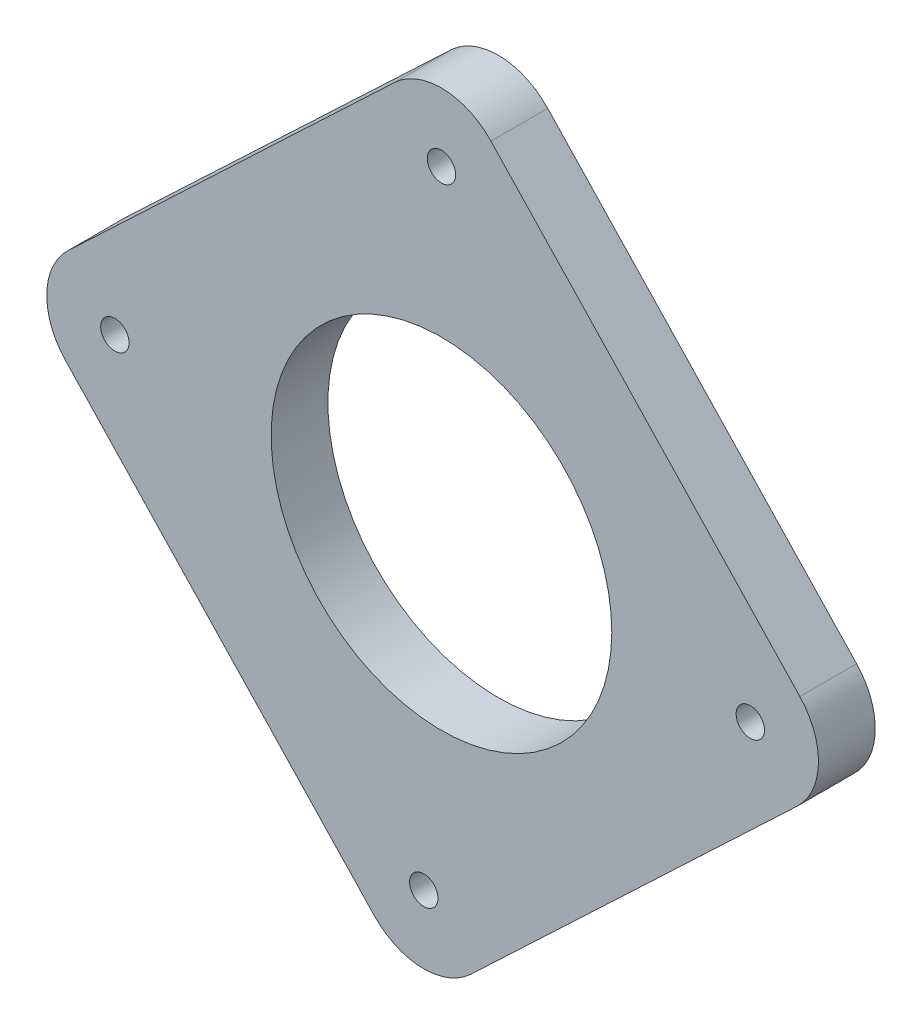
ISO-10303-21;
HEADER;
FILE_DESCRIPTION(('STEP AP214'),'2;1');
FILE_NAME('part.step','',(''),(''),'','','');
FILE_SCHEMA(('AUTOMOTIVE_DESIGN { 1 0 10303 214 1 1 1 1 }'));
ENDSEC;
DATA;
#1=APPLICATION_CONTEXT('core data for automotive mechanical design processes');
#2=APPLICATION_PROTOCOL_DEFINITION('international standard','automotive_design',2000,#1);
#3=PRODUCT_CONTEXT('',#1,'mechanical');
#4=PRODUCT('Part','Part','',(#3));
#5=PRODUCT_RELATED_PRODUCT_CATEGORY('part','',(#4));
#6=PRODUCT_DEFINITION_FORMATION('','',#4);
#7=PRODUCT_DEFINITION_CONTEXT('part definition',#1,'design');
#8=PRODUCT_DEFINITION('design','',#6,#7);
#9=PRODUCT_DEFINITION_SHAPE('','',#8);
#10=(LENGTH_UNIT() NAMED_UNIT(*) SI_UNIT(.MILLI.,.METRE.));
#11=(NAMED_UNIT(*) PLANE_ANGLE_UNIT() SI_UNIT($,.RADIAN.));
#12=(NAMED_UNIT(*) SI_UNIT($,.STERADIAN.) SOLID_ANGLE_UNIT());
#13=UNCERTAINTY_MEASURE_WITH_UNIT(LENGTH_MEASURE(1.E-05),#10,'distance_accuracy_value','');
#14=(GEOMETRIC_REPRESENTATION_CONTEXT(3) GLOBAL_UNCERTAINTY_ASSIGNED_CONTEXT((#13)) GLOBAL_UNIT_ASSIGNED_CONTEXT((#10,
#11,#12)) REPRESENTATION_CONTEXT('',''));
#15=CARTESIAN_POINT('',(0.,0.,0.));
#16=DIRECTION('',(0.,0.,1.));
#17=DIRECTION('',(1.,0.,0.));
#18=AXIS2_PLACEMENT_3D('',#15,#16,#17);
#19=CARTESIAN_POINT('',(0.,28.,5.));
#20=DIRECTION('',(0.,0.,-1.));
#21=DIRECTION('',(-1.,0.,0.));
#22=AXIS2_PLACEMENT_3D('',#19,#20,#21);
#23=PLANE('',#22);
#24=CARTESIAN_POINT('',(0.,28.,5.));
#25=DIRECTION('',(0.,0.,1.));
#26=DIRECTION('',(-1.,0.,0.));
#27=AXIS2_PLACEMENT_3D('',#24,#25,#26);
#28=CIRCLE('',#27,6.);
#29=CARTESIAN_POINT('',(4.35893264010566,32.1230700017125,5.));
#30=VERTEX_POINT('',#29);
#31=CARTESIAN_POINT('',(-4.1230700017125,32.3589326401057,5.));
#32=VERTEX_POINT('',#31);
#33=EDGE_CURVE('E145',#30,#32,#28,.T.);
#34=ORIENTED_EDGE('',*,*,#33,.T.);
#35=DIRECTION('',(-0.726488773350943,-0.68717833361875,0.));
#36=VECTOR('',#35,1.);
#37=CARTESIAN_POINT('',(-4.1230700017125,32.3589326401057,5.));
#38=LINE('',#37,#36);
#39=CARTESIAN_POINT('',(-32.8794419108442,5.15857324805163,5.));
#40=VERTEX_POINT('',#39);
#41=EDGE_CURVE('E93',#32,#40,#38,.T.);
#42=ORIENTED_EDGE('',*,*,#41,.T.);
#43=CARTESIAN_POINT('',(-28.7563719091317,0.79964060794597,5.));
#44=DIRECTION('',(0.,0.,1.));
#45=DIRECTION('',(1.,0.,0.));
#46=AXIS2_PLACEMENT_3D('',#43,#44,#45);
#47=CIRCLE('',#46,6.);
#48=CARTESIAN_POINT('',(-33.1153045492373,-3.32342939376653,5.));
#49=VERTEX_POINT('',#48);
#50=EDGE_CURVE('E160',#40,#49,#47,.T.);
#51=ORIENTED_EDGE('',*,*,#50,.T.);
#52=DIRECTION('',(0.68717833361875,-0.726488773350943,0.));
#53=VECTOR('',#52,1.);
#54=CARTESIAN_POINT('',(-33.1153045492373,-3.32342939376653,5.));
#55=LINE('',#54,#53);
#56=CARTESIAN_POINT('',(-5.91494515718328,-32.0798013028982,5.));
#57=VERTEX_POINT('',#56);
#58=EDGE_CURVE('E173',#49,#57,#55,.T.);
#59=ORIENTED_EDGE('',*,*,#58,.T.);
#60=CARTESIAN_POINT('',(-1.55601251707762,-27.9567313011857,5.));
#61=DIRECTION('',(0.,0.,1.));
#62=DIRECTION('',(1.,0.,0.));
#63=AXIS2_PLACEMENT_3D('',#60,#61,#62);
#64=CIRCLE('',#63,6.);
#65=CARTESIAN_POINT('',(2.56705748463488,-32.3156639412914,5.));
#66=VERTEX_POINT('',#65);
#67=EDGE_CURVE('E112',#57,#66,#64,.T.);
#68=ORIENTED_EDGE('',*,*,#67,.T.);
#69=DIRECTION('',(0.726488773350943,0.68717833361875,0.));
#70=VECTOR('',#69,1.);
#71=CARTESIAN_POINT('',(2.56705748463488,-32.3156639412914,5.));
#72=LINE('',#71,#70);
#73=CARTESIAN_POINT('',(31.3234293937665,-5.11530454923733,5.));
#74=VERTEX_POINT('',#73);
#75=EDGE_CURVE('E106',#66,#74,#72,.T.);
#76=ORIENTED_EDGE('',*,*,#75,.T.);
#77=CARTESIAN_POINT('',(27.200359392054,-0.756371909131676,5.));
#78=DIRECTION('',(0.,0.,1.));
#79=DIRECTION('',(-1.,0.,0.));
#80=AXIS2_PLACEMENT_3D('',#77,#78,#79);
#81=CIRCLE('',#80,6.);
#82=CARTESIAN_POINT('',(31.5592920321597,3.36669809258082,5.));
#83=VERTEX_POINT('',#82);
#84=EDGE_CURVE('E110',#74,#83,#81,.T.);
#85=ORIENTED_EDGE('',*,*,#84,.T.);
#86=DIRECTION('',(-0.68717833361875,0.726488773350943,0.));
#87=VECTOR('',#86,1.);
#88=CARTESIAN_POINT('',(31.5592920321597,3.36669809258082,5.));
#89=LINE('',#88,#87);
#90=EDGE_CURVE('E50',#83,#30,#89,.T.);
#91=ORIENTED_EDGE('',*,*,#90,.T.);
#92=EDGE_LOOP('',(#34,#42,#51,#59,#68,#76,#85,#91));
#93=FACE_BOUND('',#92,.T.);
#94=CARTESIAN_POINT('',(0.,0.,5.));
#95=DIRECTION('',(0.,0.,1.));
#96=DIRECTION('',(1.,0.,0.));
#97=AXIS2_PLACEMENT_3D('',#94,#95,#96);
#98=CIRCLE('',#97,15.);
#99=CARTESIAN_POINT('',(15.,0.,5.));
#100=VERTEX_POINT('',#99);
#101=EDGE_CURVE('E134',#100,#100,#98,.T.);
#102=ORIENTED_EDGE('',*,*,#101,.F.);
#103=EDGE_LOOP('',(#102));
#104=FACE_BOUND('',#103,.T.);
#105=CARTESIAN_POINT('',(0.,28.,5.));
#106=DIRECTION('',(0.,0.,1.));
#107=DIRECTION('',(1.,0.,0.));
#108=AXIS2_PLACEMENT_3D('',#105,#106,#107);
#109=CIRCLE('',#108,1.25);
#110=CARTESIAN_POINT('',(1.25,28.,5.));
#111=VERTEX_POINT('',#110);
#112=EDGE_CURVE('E182',#111,#111,#109,.T.);
#113=ORIENTED_EDGE('',*,*,#112,.F.);
#114=EDGE_LOOP('',(#113));
#115=FACE_BOUND('',#114,.T.);
#116=CARTESIAN_POINT('',(27.200359392054,-0.756371909131676,5.));
#117=DIRECTION('',(0.,0.,1.));
#118=DIRECTION('',(1.,0.,0.));
#119=AXIS2_PLACEMENT_3D('',#116,#117,#118);
#120=CIRCLE('',#119,1.25);
#121=CARTESIAN_POINT('',(28.450359392054,-0.756371909131676,5.));
#122=VERTEX_POINT('',#121);
#123=EDGE_CURVE('E188',#122,#122,#120,.T.);
#124=ORIENTED_EDGE('',*,*,#123,.F.);
#125=EDGE_LOOP('',(#124));
#126=FACE_BOUND('',#125,.T.);
#127=CARTESIAN_POINT('',(-1.55601251707762,-27.9567313011857,5.));
#128=DIRECTION('',(0.,0.,1.));
#129=DIRECTION('',(1.,0.,0.));
#130=AXIS2_PLACEMENT_3D('',#127,#128,#129);
#131=CIRCLE('',#130,1.25);
#132=CARTESIAN_POINT('',(-0.306012517077621,-27.9567313011857,5.));
#133=VERTEX_POINT('',#132);
#134=EDGE_CURVE('E194',#133,#133,#131,.T.);
#135=ORIENTED_EDGE('',*,*,#134,.F.);
#136=EDGE_LOOP('',(#135));
#137=FACE_BOUND('',#136,.T.);
#138=CARTESIAN_POINT('',(-28.7563719091317,0.79964060794597,5.));
#139=DIRECTION('',(0.,0.,1.));
#140=DIRECTION('',(1.,0.,0.));
#141=AXIS2_PLACEMENT_3D('',#138,#139,#140);
#142=CIRCLE('',#141,1.25);
#143=CARTESIAN_POINT('',(-27.5063719091317,0.79964060794597,5.));
#144=VERTEX_POINT('',#143);
#145=EDGE_CURVE('E200',#144,#144,#142,.T.);
#146=ORIENTED_EDGE('',*,*,#145,.F.);
#147=EDGE_LOOP('',(#146));
#148=FACE_BOUND('',#147,.T.);
#149=ADVANCED_FACE('F33',(#93,#104,#115,#126,#137,#148),#23,.F.);
#150=CARTESIAN_POINT('',(0.,28.,0.));
#151=DIRECTION('',(0.,0.,-1.));
#152=DIRECTION('',(-1.,0.,0.));
#153=AXIS2_PLACEMENT_3D('',#150,#151,#152);
#154=PLANE('',#153);
#155=CARTESIAN_POINT('',(-1.55601251707762,-27.9567313011857,0.));
#156=DIRECTION('',(0.,0.,1.));
#157=DIRECTION('',(1.,0.,0.));
#158=AXIS2_PLACEMENT_3D('',#155,#156,#157);
#159=CIRCLE('',#158,1.25);
#160=CARTESIAN_POINT('',(-0.306012517077621,-27.9567313011857,0.));
#161=VERTEX_POINT('',#160);
#162=EDGE_CURVE('E197',#161,#161,#159,.T.);
#163=ORIENTED_EDGE('',*,*,#162,.T.);
#164=EDGE_LOOP('',(#163));
#165=FACE_BOUND('',#164,.T.);
#166=CARTESIAN_POINT('',(0.,28.,0.));
#167=DIRECTION('',(0.,0.,1.));
#168=DIRECTION('',(1.,0.,0.));
#169=AXIS2_PLACEMENT_3D('',#166,#167,#168);
#170=CIRCLE('',#169,1.25);
#171=CARTESIAN_POINT('',(1.25,28.,0.));
#172=VERTEX_POINT('',#171);
#173=EDGE_CURVE('E185',#172,#172,#170,.T.);
#174=ORIENTED_EDGE('',*,*,#173,.T.);
#175=EDGE_LOOP('',(#174));
#176=FACE_BOUND('',#175,.T.);
#177=CARTESIAN_POINT('',(0.,28.,0.));
#178=DIRECTION('',(0.,0.,1.));
#179=DIRECTION('',(-1.,0.,0.));
#180=AXIS2_PLACEMENT_3D('',#177,#178,#179);
#181=CIRCLE('',#180,6.);
#182=CARTESIAN_POINT('',(4.35893264010566,32.1230700017125,0.));
#183=VERTEX_POINT('',#182);
#184=CARTESIAN_POINT('',(-4.1230700017125,32.3589326401057,0.));
#185=VERTEX_POINT('',#184);
#186=EDGE_CURVE('E130',#183,#185,#181,.T.);
#187=ORIENTED_EDGE('',*,*,#186,.F.);
#188=DIRECTION('',(-0.68717833361875,0.726488773350943,0.));
#189=VECTOR('',#188,1.);
#190=CARTESIAN_POINT('',(31.5592920321597,3.36669809258082,0.));
#191=LINE('',#190,#189);
#192=CARTESIAN_POINT('',(31.5592920321597,3.36669809258082,0.));
#193=VERTEX_POINT('',#192);
#194=EDGE_CURVE('E85',#193,#183,#191,.T.);
#195=ORIENTED_EDGE('',*,*,#194,.F.);
#196=CARTESIAN_POINT('',(27.200359392054,-0.756371909131676,0.));
#197=DIRECTION('',(0.,0.,1.));
#198=DIRECTION('',(-1.,0.,0.));
#199=AXIS2_PLACEMENT_3D('',#196,#197,#198);
#200=CIRCLE('',#199,6.);
#201=CARTESIAN_POINT('',(31.3234293937665,-5.11530454923733,0.));
#202=VERTEX_POINT('',#201);
#203=EDGE_CURVE('E79',#202,#193,#200,.T.);
#204=ORIENTED_EDGE('',*,*,#203,.F.);
#205=DIRECTION('',(0.726488773350943,0.68717833361875,0.));
#206=VECTOR('',#205,1.);
#207=CARTESIAN_POINT('',(2.56705748463488,-32.3156639412914,0.));
#208=LINE('',#207,#206);
#209=CARTESIAN_POINT('',(2.56705748463488,-32.3156639412914,0.));
#210=VERTEX_POINT('',#209);
#211=EDGE_CURVE('E120',#210,#202,#208,.T.);
#212=ORIENTED_EDGE('',*,*,#211,.F.);
#213=CARTESIAN_POINT('',(-1.55601251707762,-27.9567313011857,0.));
#214=DIRECTION('',(0.,0.,1.));
#215=DIRECTION('',(1.,0.,0.));
#216=AXIS2_PLACEMENT_3D('',#213,#214,#215);
#217=CIRCLE('',#216,6.);
#218=CARTESIAN_POINT('',(-5.91494515718328,-32.0798013028982,0.));
#219=VERTEX_POINT('',#218);
#220=EDGE_CURVE('E140',#219,#210,#217,.T.);
#221=ORIENTED_EDGE('',*,*,#220,.F.);
#222=DIRECTION('',(0.68717833361875,-0.726488773350943,0.));
#223=VECTOR('',#222,1.);
#224=CARTESIAN_POINT('',(-33.1153045492373,-3.32342939376653,0.));
#225=LINE('',#224,#223);
#226=CARTESIAN_POINT('',(-33.1153045492373,-3.32342939376653,0.));
#227=VERTEX_POINT('',#226);
#228=EDGE_CURVE('E138',#227,#219,#225,.T.);
#229=ORIENTED_EDGE('',*,*,#228,.F.);
#230=CARTESIAN_POINT('',(-28.7563719091317,0.79964060794597,0.));
#231=DIRECTION('',(0.,0.,1.));
#232=DIRECTION('',(1.,0.,0.));
#233=AXIS2_PLACEMENT_3D('',#230,#231,#232);
#234=CIRCLE('',#233,6.);
#235=CARTESIAN_POINT('',(-32.8794419108442,5.15857324805163,0.));
#236=VERTEX_POINT('',#235);
#237=EDGE_CURVE('E136',#236,#227,#234,.T.);
#238=ORIENTED_EDGE('',*,*,#237,.F.);
#239=DIRECTION('',(-0.726488773350943,-0.68717833361875,0.));
#240=VECTOR('',#239,1.);
#241=CARTESIAN_POINT('',(-4.1230700017125,32.3589326401057,0.));
#242=LINE('',#241,#240);
#243=EDGE_CURVE('E133',#185,#236,#242,.T.);
#244=ORIENTED_EDGE('',*,*,#243,.F.);
#245=EDGE_LOOP('',(#187,#195,#204,#212,#221,#229,#238,#244));
#246=FACE_BOUND('',#245,.T.);
#247=CARTESIAN_POINT('',(0.,0.,0.));
#248=DIRECTION('',(0.,0.,1.));
#249=DIRECTION('',(1.,0.,0.));
#250=AXIS2_PLACEMENT_3D('',#247,#248,#249);
#251=CIRCLE('',#250,15.);
#252=CARTESIAN_POINT('',(15.,0.,0.));
#253=VERTEX_POINT('',#252);
#254=EDGE_CURVE('E179',#253,#253,#251,.T.);
#255=ORIENTED_EDGE('',*,*,#254,.T.);
#256=EDGE_LOOP('',(#255));
#257=FACE_BOUND('',#256,.T.);
#258=CARTESIAN_POINT('',(27.200359392054,-0.756371909131676,0.));
#259=DIRECTION('',(0.,0.,1.));
#260=DIRECTION('',(1.,0.,0.));
#261=AXIS2_PLACEMENT_3D('',#258,#259,#260);
#262=CIRCLE('',#261,1.25);
#263=CARTESIAN_POINT('',(28.450359392054,-0.756371909131676,0.));
#264=VERTEX_POINT('',#263);
#265=EDGE_CURVE('E191',#264,#264,#262,.T.);
#266=ORIENTED_EDGE('',*,*,#265,.T.);
#267=EDGE_LOOP('',(#266));
#268=FACE_BOUND('',#267,.T.);
#269=CARTESIAN_POINT('',(-28.7563719091317,0.79964060794597,0.));
#270=DIRECTION('',(0.,0.,1.));
#271=DIRECTION('',(1.,0.,0.));
#272=AXIS2_PLACEMENT_3D('',#269,#270,#271);
#273=CIRCLE('',#272,1.25);
#274=CARTESIAN_POINT('',(-27.5063719091317,0.79964060794597,0.));
#275=VERTEX_POINT('',#274);
#276=EDGE_CURVE('E203',#275,#275,#273,.T.);
#277=ORIENTED_EDGE('',*,*,#276,.T.);
#278=EDGE_LOOP('',(#277));
#279=FACE_BOUND('',#278,.T.);
#280=ADVANCED_FACE('F164',(#165,#176,#246,#257,#268,#279),#154,.T.);
#281=CARTESIAN_POINT('',(0.,28.,5.));
#282=DIRECTION('',(0.,0.,-1.));
#283=DIRECTION('',(-1.,0.,0.));
#284=AXIS2_PLACEMENT_3D('',#281,#282,#283);
#285=CYLINDRICAL_SURFACE('',#284,6.);
#286=ORIENTED_EDGE('',*,*,#186,.T.);
#287=DIRECTION('',(0.,0.,-1.));
#288=VECTOR('',#287,1.);
#289=CARTESIAN_POINT('',(-4.1230700017125,32.3589326401057,5.));
#290=LINE('',#289,#288);
#291=EDGE_CURVE('E11',#32,#185,#290,.T.);
#292=ORIENTED_EDGE('',*,*,#291,.F.);
#293=ORIENTED_EDGE('',*,*,#33,.F.);
#294=DIRECTION('',(0.,0.,-1.));
#295=VECTOR('',#294,1.);
#296=CARTESIAN_POINT('',(4.35893264010566,32.1230700017125,5.));
#297=LINE('',#296,#295);
#298=EDGE_CURVE('E126',#30,#183,#297,.T.);
#299=ORIENTED_EDGE('',*,*,#298,.T.);
#300=EDGE_LOOP('',(#286,#292,#293,#299));
#301=FACE_BOUND('',#300,.T.);
#302=ADVANCED_FACE('F35',(#301),#285,.T.);
#303=CARTESIAN_POINT('',(-4.1230700017125,32.3589326401057,5.));
#304=DIRECTION('',(0.68717833361875,-0.726488773350943,0.));
#305=DIRECTION('',(0.726488773350943,0.68717833361875,0.));
#306=AXIS2_PLACEMENT_3D('',#303,#304,#305);
#307=PLANE('',#306);
#308=ORIENTED_EDGE('',*,*,#243,.T.);
#309=DIRECTION('',(0.,0.,-1.));
#310=VECTOR('',#309,1.);
#311=CARTESIAN_POINT('',(-32.8794419108442,5.15857324805163,5.));
#312=LINE('',#311,#310);
#313=EDGE_CURVE('E42',#40,#236,#312,.T.);
#314=ORIENTED_EDGE('',*,*,#313,.F.);
#315=ORIENTED_EDGE('',*,*,#41,.F.);
#316=ORIENTED_EDGE('',*,*,#291,.T.);
#317=EDGE_LOOP('',(#308,#314,#315,#316));
#318=FACE_BOUND('',#317,.T.);
#319=ADVANCED_FACE('F235',(#318),#307,.F.);
#320=CARTESIAN_POINT('',(-28.7563719091317,0.79964060794597,5.));
#321=DIRECTION('',(0.,0.,-1.));
#322=DIRECTION('',(-1.,0.,0.));
#323=AXIS2_PLACEMENT_3D('',#320,#321,#322);
#324=CYLINDRICAL_SURFACE('',#323,6.);
#325=ORIENTED_EDGE('',*,*,#237,.T.);
#326=DIRECTION('',(0.,0.,-1.));
#327=VECTOR('',#326,1.);
#328=CARTESIAN_POINT('',(-33.1153045492373,-3.32342939376653,5.));
#329=LINE('',#328,#327);
#330=EDGE_CURVE('E152',#49,#227,#329,.T.);
#331=ORIENTED_EDGE('',*,*,#330,.F.);
#332=ORIENTED_EDGE('',*,*,#50,.F.);
#333=ORIENTED_EDGE('',*,*,#313,.T.);
#334=EDGE_LOOP('',(#325,#331,#332,#333));
#335=FACE_BOUND('',#334,.T.);
#336=ADVANCED_FACE('F158',(#335),#324,.T.);
#337=CARTESIAN_POINT('',(-33.1153045492373,-3.32342939376653,5.));
#338=DIRECTION('',(0.726488773350943,0.68717833361875,0.));
#339=DIRECTION('',(-0.68717833361875,0.726488773350943,0.));
#340=AXIS2_PLACEMENT_3D('',#337,#338,#339);
#341=PLANE('',#340);
#342=ORIENTED_EDGE('',*,*,#228,.T.);
#343=DIRECTION('',(0.,0.,-1.));
#344=VECTOR('',#343,1.);
#345=CARTESIAN_POINT('',(-5.91494515718328,-32.0798013028982,5.));
#346=LINE('',#345,#344);
#347=EDGE_CURVE('E149',#57,#219,#346,.T.);
#348=ORIENTED_EDGE('',*,*,#347,.F.);
#349=ORIENTED_EDGE('',*,*,#58,.F.);
#350=ORIENTED_EDGE('',*,*,#330,.T.);
#351=EDGE_LOOP('',(#342,#348,#349,#350));
#352=FACE_BOUND('',#351,.T.);
#353=ADVANCED_FACE('F169',(#352),#341,.F.);
#354=CARTESIAN_POINT('',(-1.55601251707762,-27.9567313011857,5.));
#355=DIRECTION('',(0.,0.,-1.));
#356=DIRECTION('',(-1.,0.,0.));
#357=AXIS2_PLACEMENT_3D('',#354,#355,#356);
#358=CYLINDRICAL_SURFACE('',#357,6.);
#359=ORIENTED_EDGE('',*,*,#220,.T.);
#360=DIRECTION('',(0.,0.,-1.));
#361=VECTOR('',#360,1.);
#362=CARTESIAN_POINT('',(2.56705748463488,-32.3156639412914,5.));
#363=LINE('',#362,#361);
#364=EDGE_CURVE('E121',#66,#210,#363,.T.);
#365=ORIENTED_EDGE('',*,*,#364,.F.);
#366=ORIENTED_EDGE('',*,*,#67,.F.);
#367=ORIENTED_EDGE('',*,*,#347,.T.);
#368=EDGE_LOOP('',(#359,#365,#366,#367));
#369=FACE_BOUND('',#368,.T.);
#370=ADVANCED_FACE('F172',(#369),#358,.T.);
#371=CARTESIAN_POINT('',(2.56705748463488,-32.3156639412914,5.));
#372=DIRECTION('',(-0.68717833361875,0.726488773350943,0.));
#373=DIRECTION('',(-0.726488773350943,-0.68717833361875,0.));
#374=AXIS2_PLACEMENT_3D('',#371,#372,#373);
#375=PLANE('',#374);
#376=ORIENTED_EDGE('',*,*,#211,.T.);
#377=DIRECTION('',(0.,0.,-1.));
#378=VECTOR('',#377,1.);
#379=CARTESIAN_POINT('',(31.3234293937665,-5.11530454923733,5.));
#380=LINE('',#379,#378);
#381=EDGE_CURVE('E117',#74,#202,#380,.T.);
#382=ORIENTED_EDGE('',*,*,#381,.F.);
#383=ORIENTED_EDGE('',*,*,#75,.F.);
#384=ORIENTED_EDGE('',*,*,#364,.T.);
#385=EDGE_LOOP('',(#376,#382,#383,#384));
#386=FACE_BOUND('',#385,.T.);
#387=ADVANCED_FACE('F118',(#386),#375,.F.);
#388=CARTESIAN_POINT('',(27.200359392054,-0.756371909131676,5.));
#389=DIRECTION('',(0.,0.,-1.));
#390=DIRECTION('',(-1.,0.,0.));
#391=AXIS2_PLACEMENT_3D('',#388,#389,#390);
#392=CYLINDRICAL_SURFACE('',#391,6.);
#393=ORIENTED_EDGE('',*,*,#203,.T.);
#394=DIRECTION('',(0.,0.,-1.));
#395=VECTOR('',#394,1.);
#396=CARTESIAN_POINT('',(31.5592920321597,3.36669809258082,5.));
#397=LINE('',#396,#395);
#398=EDGE_CURVE('E122',#83,#193,#397,.T.);
#399=ORIENTED_EDGE('',*,*,#398,.F.);
#400=ORIENTED_EDGE('',*,*,#84,.F.);
#401=ORIENTED_EDGE('',*,*,#381,.T.);
#402=EDGE_LOOP('',(#393,#399,#400,#401));
#403=FACE_BOUND('',#402,.T.);
#404=ADVANCED_FACE('F124',(#403),#392,.T.);
#405=CARTESIAN_POINT('',(31.5592920321597,3.36669809258082,5.));
#406=DIRECTION('',(-0.726488773350943,-0.68717833361875,0.));
#407=DIRECTION('',(0.68717833361875,-0.726488773350943,0.));
#408=AXIS2_PLACEMENT_3D('',#405,#406,#407);
#409=PLANE('',#408);
#410=ORIENTED_EDGE('',*,*,#194,.T.);
#411=ORIENTED_EDGE('',*,*,#298,.F.);
#412=ORIENTED_EDGE('',*,*,#90,.F.);
#413=ORIENTED_EDGE('',*,*,#398,.T.);
#414=EDGE_LOOP('',(#410,#411,#412,#413));
#415=FACE_BOUND('',#414,.T.);
#416=ADVANCED_FACE('F223',(#415),#409,.F.);
#417=CARTESIAN_POINT('',(0.,0.,5.));
#418=DIRECTION('',(0.,0.,-1.));
#419=DIRECTION('',(-1.,0.,0.));
#420=AXIS2_PLACEMENT_3D('',#417,#418,#419);
#421=CYLINDRICAL_SURFACE('',#420,15.);
#422=ORIENTED_EDGE('',*,*,#101,.T.);
#423=EDGE_LOOP('',(#422));
#424=FACE_BOUND('',#423,.T.);
#425=ORIENTED_EDGE('',*,*,#254,.F.);
#426=EDGE_LOOP('',(#425));
#427=FACE_BOUND('',#426,.T.);
#428=ADVANCED_FACE('F220',(#424,#427),#421,.F.);
#429=CARTESIAN_POINT('',(0.,28.,5.));
#430=DIRECTION('',(0.,0.,-1.));
#431=DIRECTION('',(-1.,0.,0.));
#432=AXIS2_PLACEMENT_3D('',#429,#430,#431);
#433=CYLINDRICAL_SURFACE('',#432,1.25);
#434=ORIENTED_EDGE('',*,*,#112,.T.);
#435=EDGE_LOOP('',(#434));
#436=FACE_BOUND('',#435,.T.);
#437=ORIENTED_EDGE('',*,*,#173,.F.);
#438=EDGE_LOOP('',(#437));
#439=FACE_BOUND('',#438,.T.);
#440=ADVANCED_FACE('F299',(#436,#439),#433,.F.);
#441=CARTESIAN_POINT('',(27.200359392054,-0.756371909131676,5.));
#442=DIRECTION('',(0.,0.,-1.));
#443=DIRECTION('',(-1.,0.,0.));
#444=AXIS2_PLACEMENT_3D('',#441,#442,#443);
#445=CYLINDRICAL_SURFACE('',#444,1.25);
#446=ORIENTED_EDGE('',*,*,#123,.T.);
#447=EDGE_LOOP('',(#446));
#448=FACE_BOUND('',#447,.T.);
#449=ORIENTED_EDGE('',*,*,#265,.F.);
#450=EDGE_LOOP('',(#449));
#451=FACE_BOUND('',#450,.T.);
#452=ADVANCED_FACE('F307',(#448,#451),#445,.F.);
#453=CARTESIAN_POINT('',(-1.55601251707762,-27.9567313011857,5.));
#454=DIRECTION('',(0.,0.,-1.));
#455=DIRECTION('',(-1.,0.,0.));
#456=AXIS2_PLACEMENT_3D('',#453,#454,#455);
#457=CYLINDRICAL_SURFACE('',#456,1.25);
#458=ORIENTED_EDGE('',*,*,#134,.T.);
#459=EDGE_LOOP('',(#458));
#460=FACE_BOUND('',#459,.T.);
#461=ORIENTED_EDGE('',*,*,#162,.F.);
#462=EDGE_LOOP('',(#461));
#463=FACE_BOUND('',#462,.T.);
#464=ADVANCED_FACE('F315',(#460,#463),#457,.F.);
#465=CARTESIAN_POINT('',(-28.7563719091317,0.79964060794597,5.));
#466=DIRECTION('',(0.,0.,-1.));
#467=DIRECTION('',(-1.,0.,0.));
#468=AXIS2_PLACEMENT_3D('',#465,#466,#467);
#469=CYLINDRICAL_SURFACE('',#468,1.25);
#470=ORIENTED_EDGE('',*,*,#145,.T.);
#471=EDGE_LOOP('',(#470));
#472=FACE_BOUND('',#471,.T.);
#473=ORIENTED_EDGE('',*,*,#276,.F.);
#474=EDGE_LOOP('',(#473));
#475=FACE_BOUND('',#474,.T.);
#476=ADVANCED_FACE('F209',(#472,#475),#469,.F.);
#477=CLOSED_SHELL('',(#149,#280,#302,#319,#336,#353,#370,#387,#404,#416,#428,#440,#452,#464,#476));
#478=MANIFOLD_SOLID_BREP('B2',#477);
#479=ADVANCED_BREP_SHAPE_REPRESENTATION('',(#18,#478),#14);
#480=SHAPE_DEFINITION_REPRESENTATION(#9,#479);
ENDSEC;
END-ISO-10303-21;
